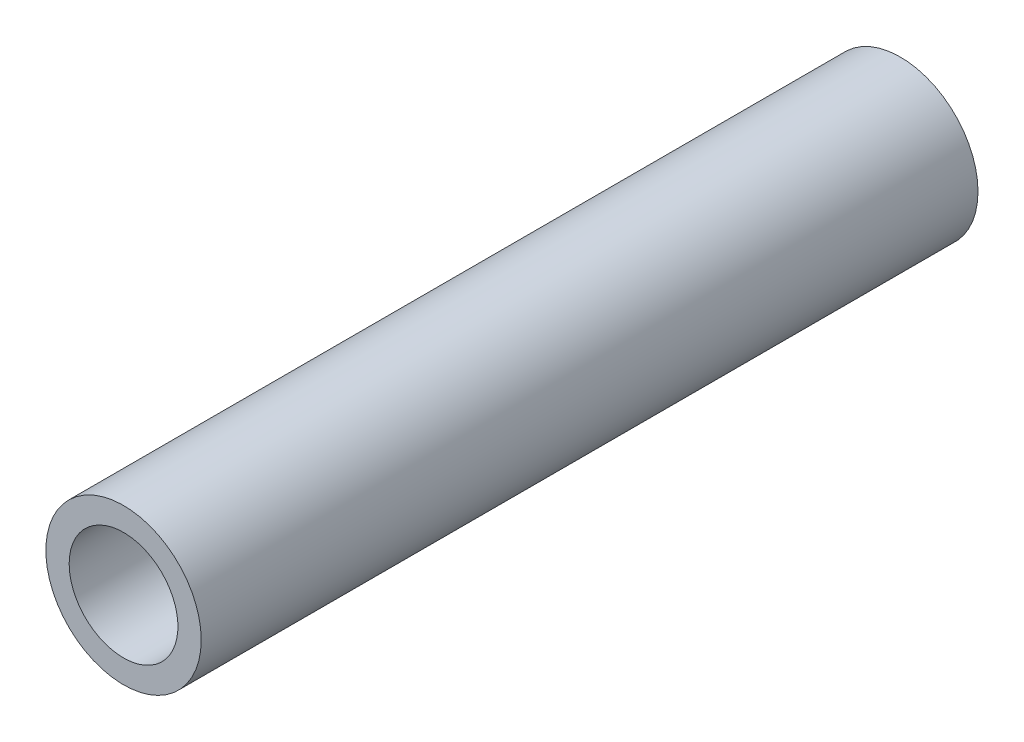
ISO-10303-21;
HEADER;
FILE_DESCRIPTION(('STEP AP214'),'2;1');
FILE_NAME('part.step','',(''),(''),'','','');
FILE_SCHEMA(('AUTOMOTIVE_DESIGN { 1 0 10303 214 1 1 1 1 }'));
ENDSEC;
DATA;
#1=APPLICATION_CONTEXT('core data for automotive mechanical design processes');
#2=APPLICATION_PROTOCOL_DEFINITION('international standard','automotive_design',2000,#1);
#3=PRODUCT_CONTEXT('',#1,'mechanical');
#4=PRODUCT('Part','Part','',(#3));
#5=PRODUCT_RELATED_PRODUCT_CATEGORY('part','',(#4));
#6=PRODUCT_DEFINITION_FORMATION('','',#4);
#7=PRODUCT_DEFINITION_CONTEXT('part definition',#1,'design');
#8=PRODUCT_DEFINITION('design','',#6,#7);
#9=PRODUCT_DEFINITION_SHAPE('','',#8);
#10=(LENGTH_UNIT() NAMED_UNIT(*) SI_UNIT(.MILLI.,.METRE.));
#11=(NAMED_UNIT(*) PLANE_ANGLE_UNIT() SI_UNIT($,.RADIAN.));
#12=(NAMED_UNIT(*) SI_UNIT($,.STERADIAN.) SOLID_ANGLE_UNIT());
#13=UNCERTAINTY_MEASURE_WITH_UNIT(LENGTH_MEASURE(1.E-05),#10,'distance_accuracy_value','');
#14=(GEOMETRIC_REPRESENTATION_CONTEXT(3) GLOBAL_UNCERTAINTY_ASSIGNED_CONTEXT((#13)) GLOBAL_UNIT_ASSIGNED_CONTEXT((#10,
#11,#12)) REPRESENTATION_CONTEXT('',''));
#15=CARTESIAN_POINT('',(0.,0.,0.));
#16=DIRECTION('',(0.,0.,1.));
#17=DIRECTION('',(1.,0.,0.));
#18=AXIS2_PLACEMENT_3D('',#15,#16,#17);
#19=CARTESIAN_POINT('',(0.,0.,100.));
#20=DIRECTION('',(0.,0.,-1.));
#21=DIRECTION('',(-1.,0.,0.));
#22=AXIS2_PLACEMENT_3D('',#19,#20,#21);
#23=CYLINDRICAL_SURFACE('',#22,10.);
#24=CARTESIAN_POINT('',(0.,0.,100.));
#25=DIRECTION('',(0.,0.,1.));
#26=DIRECTION('',(1.,0.,0.));
#27=AXIS2_PLACEMENT_3D('',#24,#25,#26);
#28=CIRCLE('',#27,10.);
#29=CARTESIAN_POINT('',(10.,0.,100.));
#30=VERTEX_POINT('',#29);
#31=EDGE_CURVE('E13',#30,#30,#28,.T.);
#32=ORIENTED_EDGE('',*,*,#31,.F.);
#33=EDGE_LOOP('',(#32));
#34=FACE_BOUND('',#33,.T.);
#35=CARTESIAN_POINT('',(0.,0.,0.));
#36=DIRECTION('',(0.,0.,1.));
#37=DIRECTION('',(1.,0.,0.));
#38=AXIS2_PLACEMENT_3D('',#35,#36,#37);
#39=CIRCLE('',#38,10.);
#40=CARTESIAN_POINT('',(10.,0.,0.));
#41=VERTEX_POINT('',#40);
#42=EDGE_CURVE('E47',#41,#41,#39,.T.);
#43=ORIENTED_EDGE('',*,*,#42,.T.);
#44=EDGE_LOOP('',(#43));
#45=FACE_BOUND('',#44,.T.);
#46=ADVANCED_FACE('F44',(#34,#45),#23,.T.);
#47=CARTESIAN_POINT('',(0.,0.,100.));
#48=DIRECTION('',(0.,0.,1.));
#49=DIRECTION('',(1.,0.,0.));
#50=AXIS2_PLACEMENT_3D('',#47,#48,#49);
#51=PLANE('',#50);
#52=CARTESIAN_POINT('',(0.,0.,100.));
#53=DIRECTION('',(0.,0.,-1.));
#54=DIRECTION('',(-1.,0.,0.));
#55=AXIS2_PLACEMENT_3D('',#52,#53,#54);
#56=CIRCLE('',#55,7.);
#57=CARTESIAN_POINT('',(-7.,0.,100.));
#58=VERTEX_POINT('',#57);
#59=EDGE_CURVE('E58',#58,#58,#56,.T.);
#60=ORIENTED_EDGE('',*,*,#59,.T.);
#61=EDGE_LOOP('',(#60));
#62=FACE_BOUND('',#61,.T.);
#63=ORIENTED_EDGE('',*,*,#31,.T.);
#64=EDGE_LOOP('',(#63));
#65=FACE_BOUND('',#64,.T.);
#66=ADVANCED_FACE('F62',(#62,#65),#51,.T.);
#67=CARTESIAN_POINT('',(0.,0.,0.));
#68=DIRECTION('',(0.,0.,1.));
#69=DIRECTION('',(1.,0.,0.));
#70=AXIS2_PLACEMENT_3D('',#67,#68,#69);
#71=PLANE('',#70);
#72=CARTESIAN_POINT('',(0.,0.,0.));
#73=DIRECTION('',(0.,0.,-1.));
#74=DIRECTION('',(-1.,0.,0.));
#75=AXIS2_PLACEMENT_3D('',#72,#73,#74);
#76=CIRCLE('',#75,7.);
#77=CARTESIAN_POINT('',(-7.,0.,0.));
#78=VERTEX_POINT('',#77);
#79=EDGE_CURVE('E54',#78,#78,#76,.T.);
#80=ORIENTED_EDGE('',*,*,#79,.F.);
#81=EDGE_LOOP('',(#80));
#82=FACE_BOUND('',#81,.T.);
#83=ORIENTED_EDGE('',*,*,#42,.F.);
#84=EDGE_LOOP('',(#83));
#85=FACE_BOUND('',#84,.T.);
#86=ADVANCED_FACE('F67',(#82,#85),#71,.F.);
#87=CARTESIAN_POINT('',(0.,0.,100.));
#88=DIRECTION('',(0.,0.,-1.));
#89=DIRECTION('',(-1.,0.,0.));
#90=AXIS2_PLACEMENT_3D('',#87,#88,#89);
#91=CYLINDRICAL_SURFACE('',#90,7.);
#92=CARTESIAN_POINT('',(-7.,0.,100.));
#93=CARTESIAN_POINT('',(-7.,0.,98.9583333333333));
#94=CARTESIAN_POINT('',(-7.,0.,97.9166666666667));
#95=CARTESIAN_POINT('',(-7.,0.,95.8333333333334));
#96=CARTESIAN_POINT('',(-7.,0.,94.7916666666667));
#97=CARTESIAN_POINT('',(-7.,0.,92.7083333333334));
#98=CARTESIAN_POINT('',(-7.,0.,91.6666666666667));
#99=CARTESIAN_POINT('',(-7.,0.,89.5833333333333));
#100=CARTESIAN_POINT('',(-7.,0.,88.5416666666667));
#101=CARTESIAN_POINT('',(-7.,0.,86.4583333333333));
#102=CARTESIAN_POINT('',(-7.,0.,85.4166666666667));
#103=CARTESIAN_POINT('',(-7.,0.,83.3333333333333));
#104=CARTESIAN_POINT('',(-7.,0.,82.2916666666667));
#105=CARTESIAN_POINT('',(-7.,0.,80.2083333333334));
#106=CARTESIAN_POINT('',(-7.,0.,79.1666666666667));
#107=CARTESIAN_POINT('',(-7.,0.,77.0833333333334));
#108=CARTESIAN_POINT('',(-7.,0.,76.0416666666667));
#109=CARTESIAN_POINT('',(-7.,0.,73.9583333333333));
#110=CARTESIAN_POINT('',(-7.,0.,72.9166666666667));
#111=CARTESIAN_POINT('',(-7.,0.,70.8333333333333));
#112=CARTESIAN_POINT('',(-7.,0.,69.7916666666667));
#113=CARTESIAN_POINT('',(-7.,0.,67.7083333333333));
#114=CARTESIAN_POINT('',(-7.,0.,66.6666666666667));
#115=CARTESIAN_POINT('',(-7.,0.,64.5833333333333));
#116=CARTESIAN_POINT('',(-7.,0.,63.5416666666667));
#117=CARTESIAN_POINT('',(-7.,0.,61.4583333333333));
#118=CARTESIAN_POINT('',(-7.,0.,60.4166666666667));
#119=CARTESIAN_POINT('',(-7.,0.,58.3333333333333));
#120=CARTESIAN_POINT('',(-7.,0.,57.2916666666667));
#121=CARTESIAN_POINT('',(-7.,0.,55.2083333333333));
#122=CARTESIAN_POINT('',(-7.,0.,54.1666666666667));
#123=CARTESIAN_POINT('',(-7.,0.,52.0833333333333));
#124=CARTESIAN_POINT('',(-7.,0.,51.0416666666667));
#125=CARTESIAN_POINT('',(-7.,0.,48.9583333333333));
#126=CARTESIAN_POINT('',(-7.,0.,47.9166666666667));
#127=CARTESIAN_POINT('',(-7.,0.,45.8333333333333));
#128=CARTESIAN_POINT('',(-7.,0.,44.7916666666667));
#129=CARTESIAN_POINT('',(-7.,0.,42.7083333333333));
#130=CARTESIAN_POINT('',(-7.,0.,41.6666666666667));
#131=CARTESIAN_POINT('',(-7.,0.,39.5833333333333));
#132=CARTESIAN_POINT('',(-7.,0.,38.5416666666667));
#133=CARTESIAN_POINT('',(-7.,0.,36.4583333333333));
#134=CARTESIAN_POINT('',(-7.,0.,35.4166666666667));
#135=CARTESIAN_POINT('',(-7.,0.,33.3333333333333));
#136=CARTESIAN_POINT('',(-7.,0.,32.2916666666667));
#137=CARTESIAN_POINT('',(-7.,0.,30.2083333333333));
#138=CARTESIAN_POINT('',(-7.,0.,29.1666666666667));
#139=CARTESIAN_POINT('',(-7.,0.,27.0833333333333));
#140=CARTESIAN_POINT('',(-7.,0.,26.0416666666667));
#141=CARTESIAN_POINT('',(-7.,0.,23.9583333333333));
#142=CARTESIAN_POINT('',(-7.,0.,22.9166666666667));
#143=CARTESIAN_POINT('',(-7.,0.,20.8333333333333));
#144=CARTESIAN_POINT('',(-7.,0.,19.7916666666667));
#145=CARTESIAN_POINT('',(-7.,0.,17.7083333333333));
#146=CARTESIAN_POINT('',(-7.,0.,16.6666666666667));
#147=CARTESIAN_POINT('',(-7.,0.,14.5833333333333));
#148=CARTESIAN_POINT('',(-7.,0.,13.5416666666667));
#149=CARTESIAN_POINT('',(-7.,0.,11.4583333333333));
#150=CARTESIAN_POINT('',(-7.,0.,10.4166666666667));
#151=CARTESIAN_POINT('',(-7.,0.,8.33333333333333));
#152=CARTESIAN_POINT('',(-7.,0.,7.29166666666667));
#153=CARTESIAN_POINT('',(-7.,0.,5.20833333333334));
#154=CARTESIAN_POINT('',(-7.,0.,4.16666666666667));
#155=CARTESIAN_POINT('',(-7.,0.,2.08333333333334));
#156=CARTESIAN_POINT('',(-7.,0.,1.04166666666667));
#157=CARTESIAN_POINT('',(-7.,0.,0.));
#158=B_SPLINE_CURVE_WITH_KNOTS('',3,(#92,#93,#94,#95,#96,#97,#98,#99,#100,#101,#102,#103,#104,
#105,#106,#107,#108,#109,#110,#111,#112,#113,#114,#115,#116,#117,#118,#119,#120,#121,#122,#123,
#124,#125,#126,#127,#128,#129,#130,#131,#132,#133,#134,#135,#136,#137,#138,#139,#140,#141,#142,
#143,#144,#145,#146,#147,#148,#149,#150,#151,#152,#153,#154,#155,#156,#157),.UNSPECIFIED.,.F.,
.F.,(4,2,2,2,2,2,2,2,2,2,2,2,2,2,2,2,2,2,2,2,2,2,2,2,2,2,2,2,2,2,2,2,4),(0.,3.12499999999999,
6.24999999999999,9.37499999999999,12.5,15.625,18.75,21.875,25.,28.125,31.25,34.375,37.5,40.625,
43.75,46.875,50.,53.125,56.25,59.375,62.5,65.625,68.75,71.875,75.,78.125,81.25,84.375,87.5,
90.625,93.75,96.875,100.),.UNSPECIFIED.);
#159=EDGE_CURVE('BSEAM64',#58,#78,#158,.T.);
#160=ORIENTED_EDGE('',*,*,#59,.F.);
#161=ORIENTED_EDGE('',*,*,#79,.T.);
#162=ORIENTED_EDGE('',*,*,#159,.T.);
#163=ORIENTED_EDGE('',*,*,#159,.F.);
#164=EDGE_LOOP('',(#160,#162,#161,#163));
#165=FACE_BOUND('',#164,.T.);
#166=ADVANCED_FACE('F64',(#165),#91,.F.);
#167=CLOSED_SHELL('',(#46,#66,#86,#166));
#168=MANIFOLD_SOLID_BREP('B2',#167);
#169=ADVANCED_BREP_SHAPE_REPRESENTATION('',(#18,#168),#14);
#170=SHAPE_DEFINITION_REPRESENTATION(#9,#169);
ENDSEC;
END-ISO-10303-21;
